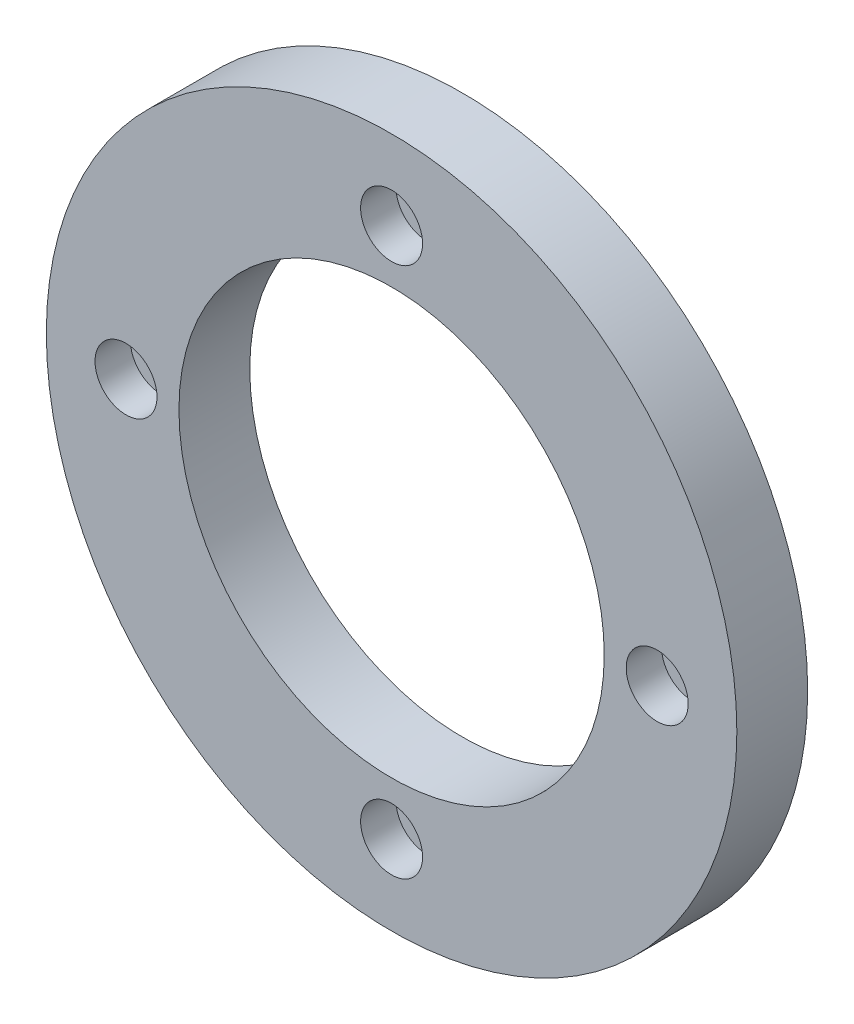
ISO-10303-21;
HEADER;
FILE_DESCRIPTION(('STEP AP214'),'2;1');
FILE_NAME('part.step','',(''),(''),'','','');
FILE_SCHEMA(('AUTOMOTIVE_DESIGN { 1 0 10303 214 1 1 1 1 }'));
ENDSEC;
DATA;
#1=APPLICATION_CONTEXT('core data for automotive mechanical design processes');
#2=APPLICATION_PROTOCOL_DEFINITION('international standard','automotive_design',2000,#1);
#3=PRODUCT_CONTEXT('',#1,'mechanical');
#4=PRODUCT('Part','Part','',(#3));
#5=PRODUCT_RELATED_PRODUCT_CATEGORY('part','',(#4));
#6=PRODUCT_DEFINITION_FORMATION('','',#4);
#7=PRODUCT_DEFINITION_CONTEXT('part definition',#1,'design');
#8=PRODUCT_DEFINITION('design','',#6,#7);
#9=PRODUCT_DEFINITION_SHAPE('','',#8);
#10=(LENGTH_UNIT() NAMED_UNIT(*) SI_UNIT(.MILLI.,.METRE.));
#11=(NAMED_UNIT(*) PLANE_ANGLE_UNIT() SI_UNIT($,.RADIAN.));
#12=(NAMED_UNIT(*) SI_UNIT($,.STERADIAN.) SOLID_ANGLE_UNIT());
#13=UNCERTAINTY_MEASURE_WITH_UNIT(LENGTH_MEASURE(1.E-05),#10,'distance_accuracy_value','');
#14=(GEOMETRIC_REPRESENTATION_CONTEXT(3) GLOBAL_UNCERTAINTY_ASSIGNED_CONTEXT((#13)) GLOBAL_UNIT_ASSIGNED_CONTEXT((#10,
#11,#12)) REPRESENTATION_CONTEXT('',''));
#15=CARTESIAN_POINT('',(0.,0.,0.));
#16=DIRECTION('',(0.,0.,1.));
#17=DIRECTION('',(1.,0.,0.));
#18=AXIS2_PLACEMENT_3D('',#15,#16,#17);
#19=CARTESIAN_POINT('',(0.,0.,15.));
#20=DIRECTION('',(0.,0.,1.));
#21=DIRECTION('',(1.,0.,0.));
#22=AXIS2_PLACEMENT_3D('',#19,#20,#21);
#23=PLANE('',#22);
#24=CARTESIAN_POINT('',(0.,0.,15.));
#25=DIRECTION('',(0.,0.,1.));
#26=DIRECTION('',(-1.,0.,0.));
#27=AXIS2_PLACEMENT_3D('',#24,#25,#26);
#28=CIRCLE('',#27,6.005);
#29=CARTESIAN_POINT('',(6.005,0.,15.));
#30=VERTEX_POINT('',#29);
#31=EDGE_CURVE('E90',#30,#30,#28,.T.);
#32=ORIENTED_EDGE('',*,*,#31,.T.);
#33=EDGE_LOOP('',(#32));
#34=FACE_BOUND('',#33,.T.);
#35=CARTESIAN_POINT('',(0.,0.,15.));
#36=DIRECTION('',(0.,0.,-1.));
#37=DIRECTION('',(-1.,0.,0.));
#38=AXIS2_PLACEMENT_3D('',#35,#36,#37);
#39=CIRCLE('',#38,9.75);
#40=CARTESIAN_POINT('',(9.75,0.,15.));
#41=VERTEX_POINT('',#40);
#42=EDGE_CURVE('E128',#41,#41,#39,.T.);
#43=ORIENTED_EDGE('',*,*,#42,.T.);
#44=EDGE_LOOP('',(#43));
#45=FACE_BOUND('',#44,.T.);
#46=ADVANCED_FACE('F17',(#34,#45),#23,.F.);
#47=CARTESIAN_POINT('',(0.,0.,17.));
#48=DIRECTION('',(0.,0.,1.));
#49=DIRECTION('',(1.,0.,0.));
#50=AXIS2_PLACEMENT_3D('',#47,#48,#49);
#51=PLANE('',#50);
#52=CARTESIAN_POINT('',(0.,0.,17.));
#53=DIRECTION('',(0.,0.,-1.));
#54=DIRECTION('',(-1.,0.,0.));
#55=AXIS2_PLACEMENT_3D('',#52,#53,#54);
#56=CIRCLE('',#55,6.005);
#57=CARTESIAN_POINT('',(6.005,0.,17.));
#58=VERTEX_POINT('',#57);
#59=EDGE_CURVE('E89',#58,#58,#56,.T.);
#60=ORIENTED_EDGE('',*,*,#59,.T.);
#61=EDGE_LOOP('',(#60));
#62=FACE_BOUND('',#61,.T.);
#63=CARTESIAN_POINT('',(0.,7.5,17.));
#64=DIRECTION('',(0.,0.,-1.));
#65=DIRECTION('',(-1.,0.,0.));
#66=AXIS2_PLACEMENT_3D('',#63,#64,#65);
#67=CIRCLE('',#66,0.875);
#68=CARTESIAN_POINT('',(0.875,7.5,17.));
#69=VERTEX_POINT('',#68);
#70=EDGE_CURVE('E123',#69,#69,#67,.T.);
#71=ORIENTED_EDGE('',*,*,#70,.T.);
#72=EDGE_LOOP('',(#71));
#73=FACE_BOUND('',#72,.T.);
#74=CARTESIAN_POINT('',(7.5,0.,17.));
#75=DIRECTION('',(0.,0.,-1.));
#76=DIRECTION('',(-1.,0.,0.));
#77=AXIS2_PLACEMENT_3D('',#74,#75,#76);
#78=CIRCLE('',#77,0.875);
#79=CARTESIAN_POINT('',(8.375,0.,17.));
#80=VERTEX_POINT('',#79);
#81=EDGE_CURVE('E119',#80,#80,#78,.T.);
#82=ORIENTED_EDGE('',*,*,#81,.T.);
#83=EDGE_LOOP('',(#82));
#84=FACE_BOUND('',#83,.T.);
#85=CARTESIAN_POINT('',(-7.5,0.,17.));
#86=DIRECTION('',(0.,0.,-1.));
#87=DIRECTION('',(-1.,0.,0.));
#88=AXIS2_PLACEMENT_3D('',#85,#86,#87);
#89=CIRCLE('',#88,0.875);
#90=CARTESIAN_POINT('',(-6.625,0.,17.));
#91=VERTEX_POINT('',#90);
#92=EDGE_CURVE('E106',#91,#91,#89,.T.);
#93=ORIENTED_EDGE('',*,*,#92,.T.);
#94=EDGE_LOOP('',(#93));
#95=FACE_BOUND('',#94,.T.);
#96=CARTESIAN_POINT('',(0.,-7.5,17.));
#97=DIRECTION('',(0.,0.,-1.));
#98=DIRECTION('',(-1.,0.,0.));
#99=AXIS2_PLACEMENT_3D('',#96,#97,#98);
#100=CIRCLE('',#99,0.875);
#101=CARTESIAN_POINT('',(0.875,-7.5,17.));
#102=VERTEX_POINT('',#101);
#103=EDGE_CURVE('E139',#102,#102,#100,.T.);
#104=ORIENTED_EDGE('',*,*,#103,.T.);
#105=EDGE_LOOP('',(#104));
#106=FACE_BOUND('',#105,.T.);
#107=CARTESIAN_POINT('',(0.,0.,17.));
#108=DIRECTION('',(0.,0.,1.));
#109=DIRECTION('',(-1.,0.,0.));
#110=AXIS2_PLACEMENT_3D('',#107,#108,#109);
#111=CIRCLE('',#110,9.75);
#112=CARTESIAN_POINT('',(9.75,0.,17.));
#113=VERTEX_POINT('',#112);
#114=EDGE_CURVE('E11',#113,#113,#111,.T.);
#115=ORIENTED_EDGE('',*,*,#114,.T.);
#116=EDGE_LOOP('',(#115));
#117=FACE_BOUND('',#116,.T.);
#118=ADVANCED_FACE('F154',(#62,#73,#84,#95,#106,#117),#51,.T.);
#119=CARTESIAN_POINT('',(0.,0.,17.));
#120=DIRECTION('',(0.,0.,-1.));
#121=DIRECTION('',(-1.,0.,0.));
#122=AXIS2_PLACEMENT_3D('',#119,#120,#121);
#123=CYLINDRICAL_SURFACE('',#122,9.75);
#124=ORIENTED_EDGE('',*,*,#42,.F.);
#125=DIRECTION('',(0.,0.,1.));
#126=VECTOR('',#125,1.);
#127=CARTESIAN_POINT('',(9.75,0.,17.));
#128=LINE('',#127,#126);
#129=EDGE_CURVE('E25',#41,#113,#128,.T.);
#130=ORIENTED_EDGE('',*,*,#129,.T.);
#131=ORIENTED_EDGE('',*,*,#114,.F.);
#132=ORIENTED_EDGE('',*,*,#129,.F.);
#133=EDGE_LOOP('',(#124,#130,#131,#132));
#134=FACE_BOUND('',#133,.T.);
#135=ADVANCED_FACE('F158',(#134),#123,.T.);
#136=CARTESIAN_POINT('',(0.,0.,17.));
#137=DIRECTION('',(0.,0.,-1.));
#138=DIRECTION('',(-1.,0.,0.));
#139=AXIS2_PLACEMENT_3D('',#136,#137,#138);
#140=CYLINDRICAL_SURFACE('',#139,6.005);
#141=ORIENTED_EDGE('',*,*,#31,.F.);
#142=DIRECTION('',(0.,0.,1.));
#143=VECTOR('',#142,1.);
#144=CARTESIAN_POINT('',(6.005,0.,17.));
#145=LINE('',#144,#143);
#146=EDGE_CURVE('E88',#30,#58,#145,.T.);
#147=ORIENTED_EDGE('',*,*,#146,.T.);
#148=ORIENTED_EDGE('',*,*,#59,.F.);
#149=ORIENTED_EDGE('',*,*,#146,.F.);
#150=EDGE_LOOP('',(#141,#147,#148,#149));
#151=FACE_BOUND('',#150,.T.);
#152=ADVANCED_FACE('F86',(#151),#140,.F.);
#153=CARTESIAN_POINT('',(0.,7.5,16.));
#154=DIRECTION('',(0.,0.,1.));
#155=DIRECTION('',(1.,0.,0.));
#156=AXIS2_PLACEMENT_3D('',#153,#154,#155);
#157=PLANE('',#156);
#158=CARTESIAN_POINT('',(0.,7.5,16.));
#159=DIRECTION('',(0.,0.,-1.));
#160=DIRECTION('',(-1.,0.,0.));
#161=AXIS2_PLACEMENT_3D('',#158,#159,#160);
#162=CIRCLE('',#161,0.875);
#163=CARTESIAN_POINT('',(0.875,7.5,16.));
#164=VERTEX_POINT('',#163);
#165=EDGE_CURVE('E96',#164,#164,#162,.T.);
#166=ORIENTED_EDGE('',*,*,#165,.F.);
#167=EDGE_LOOP('',(#166));
#168=FACE_BOUND('',#167,.T.);
#169=ADVANCED_FACE('F221',(#168),#157,.T.);
#170=CARTESIAN_POINT('',(0.,7.5,17.));
#171=DIRECTION('',(0.,0.,-1.));
#172=DIRECTION('',(-1.,0.,0.));
#173=AXIS2_PLACEMENT_3D('',#170,#171,#172);
#174=CYLINDRICAL_SURFACE('',#173,0.875);
#175=ORIENTED_EDGE('',*,*,#70,.F.);
#176=DIRECTION('',(0.,0.,-1.));
#177=VECTOR('',#176,1.);
#178=CARTESIAN_POINT('',(0.875,7.5,17.));
#179=LINE('',#178,#177);
#180=EDGE_CURVE('E105',#69,#164,#179,.T.);
#181=ORIENTED_EDGE('',*,*,#180,.T.);
#182=ORIENTED_EDGE('',*,*,#165,.T.);
#183=ORIENTED_EDGE('',*,*,#180,.F.);
#184=EDGE_LOOP('',(#175,#181,#182,#183));
#185=FACE_BOUND('',#184,.T.);
#186=ADVANCED_FACE('F155',(#185),#174,.F.);
#187=CARTESIAN_POINT('',(7.5,0.,16.));
#188=DIRECTION('',(0.,0.,1.));
#189=DIRECTION('',(1.,0.,0.));
#190=AXIS2_PLACEMENT_3D('',#187,#188,#189);
#191=PLANE('',#190);
#192=CARTESIAN_POINT('',(7.5,0.,16.));
#193=DIRECTION('',(0.,0.,-1.));
#194=DIRECTION('',(-1.,0.,0.));
#195=AXIS2_PLACEMENT_3D('',#192,#193,#194);
#196=CIRCLE('',#195,0.875);
#197=CARTESIAN_POINT('',(8.375,0.,16.));
#198=VERTEX_POINT('',#197);
#199=EDGE_CURVE('E117',#198,#198,#196,.T.);
#200=ORIENTED_EDGE('',*,*,#199,.F.);
#201=EDGE_LOOP('',(#200));
#202=FACE_BOUND('',#201,.T.);
#203=ADVANCED_FACE('F268',(#202),#191,.T.);
#204=CARTESIAN_POINT('',(7.5,0.,17.));
#205=DIRECTION('',(0.,0.,-1.));
#206=DIRECTION('',(-1.,0.,0.));
#207=AXIS2_PLACEMENT_3D('',#204,#205,#206);
#208=CYLINDRICAL_SURFACE('',#207,0.875);
#209=ORIENTED_EDGE('',*,*,#81,.F.);
#210=DIRECTION('',(0.,0.,-1.));
#211=VECTOR('',#210,1.);
#212=CARTESIAN_POINT('',(8.375,0.,17.));
#213=LINE('',#212,#211);
#214=EDGE_CURVE('E114',#80,#198,#213,.T.);
#215=ORIENTED_EDGE('',*,*,#214,.T.);
#216=ORIENTED_EDGE('',*,*,#199,.T.);
#217=ORIENTED_EDGE('',*,*,#214,.F.);
#218=EDGE_LOOP('',(#209,#215,#216,#217));
#219=FACE_BOUND('',#218,.T.);
#220=ADVANCED_FACE('F277',(#219),#208,.F.);
#221=CARTESIAN_POINT('',(-7.5,0.,16.));
#222=DIRECTION('',(0.,0.,1.));
#223=DIRECTION('',(1.,0.,0.));
#224=AXIS2_PLACEMENT_3D('',#221,#222,#223);
#225=PLANE('',#224);
#226=CARTESIAN_POINT('',(-7.5,0.,16.));
#227=DIRECTION('',(0.,0.,-1.));
#228=DIRECTION('',(-1.,0.,0.));
#229=AXIS2_PLACEMENT_3D('',#226,#227,#228);
#230=CIRCLE('',#229,0.875);
#231=CARTESIAN_POINT('',(-6.625,0.,16.));
#232=VERTEX_POINT('',#231);
#233=EDGE_CURVE('E115',#232,#232,#230,.T.);
#234=ORIENTED_EDGE('',*,*,#233,.F.);
#235=EDGE_LOOP('',(#234));
#236=FACE_BOUND('',#235,.T.);
#237=ADVANCED_FACE('F253',(#236),#225,.T.);
#238=CARTESIAN_POINT('',(-7.5,0.,17.));
#239=DIRECTION('',(0.,0.,-1.));
#240=DIRECTION('',(-1.,0.,0.));
#241=AXIS2_PLACEMENT_3D('',#238,#239,#240);
#242=CYLINDRICAL_SURFACE('',#241,0.875);
#243=ORIENTED_EDGE('',*,*,#92,.F.);
#244=DIRECTION('',(0.,0.,-1.));
#245=VECTOR('',#244,1.);
#246=CARTESIAN_POINT('',(-6.625,0.,17.));
#247=LINE('',#246,#245);
#248=EDGE_CURVE('E107',#91,#232,#247,.T.);
#249=ORIENTED_EDGE('',*,*,#248,.T.);
#250=ORIENTED_EDGE('',*,*,#233,.T.);
#251=ORIENTED_EDGE('',*,*,#248,.F.);
#252=EDGE_LOOP('',(#243,#249,#250,#251));
#253=FACE_BOUND('',#252,.T.);
#254=ADVANCED_FACE('F247',(#253),#242,.F.);
#255=CARTESIAN_POINT('',(0.,-7.5,16.));
#256=DIRECTION('',(0.,0.,1.));
#257=DIRECTION('',(1.,0.,0.));
#258=AXIS2_PLACEMENT_3D('',#255,#256,#257);
#259=PLANE('',#258);
#260=CARTESIAN_POINT('',(0.,-7.5,16.));
#261=DIRECTION('',(0.,0.,-1.));
#262=DIRECTION('',(-1.,0.,0.));
#263=AXIS2_PLACEMENT_3D('',#260,#261,#262);
#264=CIRCLE('',#263,0.875);
#265=CARTESIAN_POINT('',(0.875,-7.5,16.));
#266=VERTEX_POINT('',#265);
#267=EDGE_CURVE('E145',#266,#266,#264,.T.);
#268=ORIENTED_EDGE('',*,*,#267,.F.);
#269=EDGE_LOOP('',(#268));
#270=FACE_BOUND('',#269,.T.);
#271=ADVANCED_FACE('F232',(#270),#259,.T.);
#272=CARTESIAN_POINT('',(0.,-7.5,17.));
#273=DIRECTION('',(0.,0.,-1.));
#274=DIRECTION('',(-1.,0.,0.));
#275=AXIS2_PLACEMENT_3D('',#272,#273,#274);
#276=CYLINDRICAL_SURFACE('',#275,0.875);
#277=ORIENTED_EDGE('',*,*,#103,.F.);
#278=DIRECTION('',(0.,0.,-1.));
#279=VECTOR('',#278,1.);
#280=CARTESIAN_POINT('',(0.875,-7.5,17.));
#281=LINE('',#280,#279);
#282=EDGE_CURVE('E138',#102,#266,#281,.T.);
#283=ORIENTED_EDGE('',*,*,#282,.T.);
#284=ORIENTED_EDGE('',*,*,#267,.T.);
#285=ORIENTED_EDGE('',*,*,#282,.F.);
#286=EDGE_LOOP('',(#277,#283,#284,#285));
#287=FACE_BOUND('',#286,.T.);
#288=ADVANCED_FACE('F230',(#287),#276,.F.);
#289=CLOSED_SHELL('',(#46,#118,#135,#152,#169,#186,#203,#220,#237,#254,#271,#288));
#290=MANIFOLD_SOLID_BREP('B1',#289);
#291=ADVANCED_BREP_SHAPE_REPRESENTATION('',(#18,#290),#14);
#292=SHAPE_DEFINITION_REPRESENTATION(#9,#291);
ENDSEC;
END-ISO-10303-21;
